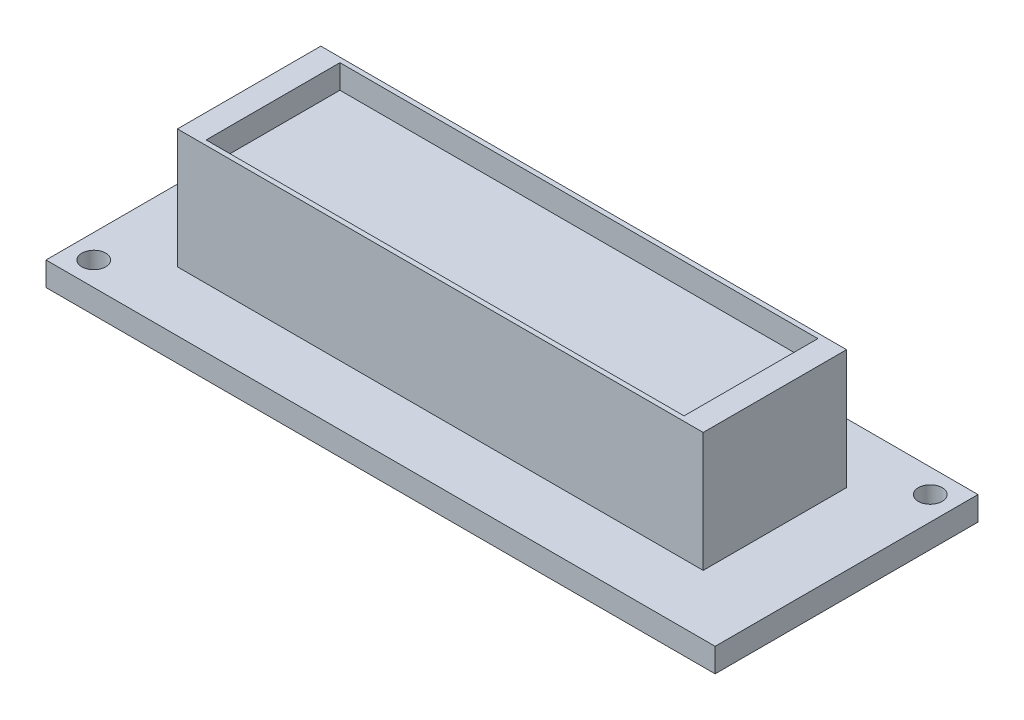
ISO-10303-21;
HEADER;
FILE_DESCRIPTION(('STEP AP214'),'2;1');
FILE_NAME('part.step','',(''),(''),'','','');
FILE_SCHEMA(('AUTOMOTIVE_DESIGN { 1 0 10303 214 1 1 1 1 }'));
ENDSEC;
DATA;
#1=APPLICATION_CONTEXT('core data for automotive mechanical design processes');
#2=APPLICATION_PROTOCOL_DEFINITION('international standard','automotive_design',2000,#1);
#3=PRODUCT_CONTEXT('',#1,'mechanical');
#4=PRODUCT('Part','Part','',(#3));
#5=PRODUCT_RELATED_PRODUCT_CATEGORY('part','',(#4));
#6=PRODUCT_DEFINITION_FORMATION('','',#4);
#7=PRODUCT_DEFINITION_CONTEXT('part definition',#1,'design');
#8=PRODUCT_DEFINITION('design','',#6,#7);
#9=PRODUCT_DEFINITION_SHAPE('','',#8);
#10=(LENGTH_UNIT() NAMED_UNIT(*) SI_UNIT(.MILLI.,.METRE.));
#11=(NAMED_UNIT(*) PLANE_ANGLE_UNIT() SI_UNIT($,.RADIAN.));
#12=(NAMED_UNIT(*) SI_UNIT($,.STERADIAN.) SOLID_ANGLE_UNIT());
#13=UNCERTAINTY_MEASURE_WITH_UNIT(LENGTH_MEASURE(1.E-05),#10,'distance_accuracy_value','');
#14=(GEOMETRIC_REPRESENTATION_CONTEXT(3) GLOBAL_UNCERTAINTY_ASSIGNED_CONTEXT((#13)) GLOBAL_UNIT_ASSIGNED_CONTEXT((#10,
#11,#12)) REPRESENTATION_CONTEXT('',''));
#15=CARTESIAN_POINT('',(0.,0.,0.));
#16=DIRECTION('',(0.,0.,1.));
#17=DIRECTION('',(1.,0.,0.));
#18=AXIS2_PLACEMENT_3D('',#15,#16,#17);
#19=CARTESIAN_POINT('',(0.,1.,-28.));
#20=DIRECTION('',(1.,0.,0.));
#21=DIRECTION('',(0.,0.,-1.));
#22=AXIS2_PLACEMENT_3D('',#19,#20,#21);
#23=PLANE('',#22);
#24=DIRECTION('',(0.,0.,1.));
#25=VECTOR('',#24,1.);
#26=CARTESIAN_POINT('',(0.,1.,0.));
#27=LINE('',#26,#25);
#28=CARTESIAN_POINT('',(0.,1.,-28.));
#29=VERTEX_POINT('',#28);
#30=CARTESIAN_POINT('',(0.,1.,0.));
#31=VERTEX_POINT('',#30);
#32=EDGE_CURVE('E233',#29,#31,#27,.T.);
#33=ORIENTED_EDGE('',*,*,#32,.F.);
#34=DIRECTION('',(0.,-1.,0.));
#35=VECTOR('',#34,1.);
#36=CARTESIAN_POINT('',(0.,1.,-28.));
#37=LINE('',#36,#35);
#38=CARTESIAN_POINT('',(0.,0.,-28.));
#39=VERTEX_POINT('',#38);
#40=EDGE_CURVE('E330',#29,#39,#37,.T.);
#41=ORIENTED_EDGE('',*,*,#40,.T.);
#42=DIRECTION('',(0.,0.,1.));
#43=VECTOR('',#42,1.);
#44=CARTESIAN_POINT('',(0.,0.,-28.));
#45=LINE('',#44,#43);
#46=CARTESIAN_POINT('',(0.,0.,0.));
#47=VERTEX_POINT('',#46);
#48=EDGE_CURVE('E314',#39,#47,#45,.T.);
#49=ORIENTED_EDGE('',*,*,#48,.T.);
#50=DIRECTION('',(0.,-1.,0.));
#51=VECTOR('',#50,1.);
#52=CARTESIAN_POINT('',(0.,1.,0.));
#53=LINE('',#52,#51);
#54=EDGE_CURVE('E11',#31,#47,#53,.T.);
#55=ORIENTED_EDGE('',*,*,#54,.F.);
#56=EDGE_LOOP('',(#33,#41,#49,#55));
#57=FACE_BOUND('',#56,.T.);
#58=ADVANCED_FACE('F41',(#57),#23,.F.);
#59=CARTESIAN_POINT('',(0.,1.,0.));
#60=DIRECTION('',(0.,0.,-1.));
#61=DIRECTION('',(-1.,0.,0.));
#62=AXIS2_PLACEMENT_3D('',#59,#60,#61);
#63=PLANE('',#62);
#64=DIRECTION('',(1.,0.,0.));
#65=VECTOR('',#64,1.);
#66=CARTESIAN_POINT('',(0.,1.,0.));
#67=LINE('',#66,#65);
#68=CARTESIAN_POINT('',(100.,1.,0.));
#69=VERTEX_POINT('',#68);
#70=EDGE_CURVE('E55',#31,#69,#67,.T.);
#71=ORIENTED_EDGE('',*,*,#70,.F.);
#72=ORIENTED_EDGE('',*,*,#54,.T.);
#73=DIRECTION('',(1.,0.,0.));
#74=VECTOR('',#73,1.);
#75=CARTESIAN_POINT('',(0.,0.,0.));
#76=LINE('',#75,#74);
#77=CARTESIAN_POINT('',(100.,0.,0.));
#78=VERTEX_POINT('',#77);
#79=EDGE_CURVE('E318',#47,#78,#76,.T.);
#80=ORIENTED_EDGE('',*,*,#79,.T.);
#81=DIRECTION('',(0.,-1.,0.));
#82=VECTOR('',#81,1.);
#83=CARTESIAN_POINT('',(100.,1.,0.));
#84=LINE('',#83,#82);
#85=EDGE_CURVE('E49',#69,#78,#84,.T.);
#86=ORIENTED_EDGE('',*,*,#85,.F.);
#87=EDGE_LOOP('',(#71,#72,#80,#86));
#88=FACE_BOUND('',#87,.T.);
#89=ADVANCED_FACE('F340',(#88),#63,.F.);
#90=CARTESIAN_POINT('',(100.,1.,0.));
#91=DIRECTION('',(-1.,0.,0.));
#92=DIRECTION('',(0.,0.,1.));
#93=AXIS2_PLACEMENT_3D('',#90,#91,#92);
#94=PLANE('',#93);
#95=DIRECTION('',(0.,0.,-1.));
#96=VECTOR('',#95,1.);
#97=CARTESIAN_POINT('',(100.,1.,0.));
#98=LINE('',#97,#96);
#99=CARTESIAN_POINT('',(100.,1.,-28.));
#100=VERTEX_POINT('',#99);
#101=EDGE_CURVE('E63',#69,#100,#98,.T.);
#102=ORIENTED_EDGE('',*,*,#101,.F.);
#103=ORIENTED_EDGE('',*,*,#85,.T.);
#104=DIRECTION('',(0.,0.,-1.));
#105=VECTOR('',#104,1.);
#106=CARTESIAN_POINT('',(100.,0.,0.));
#107=LINE('',#106,#105);
#108=CARTESIAN_POINT('',(100.,0.,-28.));
#109=VERTEX_POINT('',#108);
#110=EDGE_CURVE('E322',#78,#109,#107,.T.);
#111=ORIENTED_EDGE('',*,*,#110,.T.);
#112=DIRECTION('',(0.,-1.,0.));
#113=VECTOR('',#112,1.);
#114=CARTESIAN_POINT('',(100.,1.,-28.));
#115=LINE('',#114,#113);
#116=EDGE_CURVE('E333',#100,#109,#115,.T.);
#117=ORIENTED_EDGE('',*,*,#116,.F.);
#118=EDGE_LOOP('',(#102,#103,#111,#117));
#119=FACE_BOUND('',#118,.T.);
#120=ADVANCED_FACE('F336',(#119),#94,.F.);
#121=CARTESIAN_POINT('',(100.,1.,-28.));
#122=DIRECTION('',(0.,0.,1.));
#123=DIRECTION('',(1.,0.,0.));
#124=AXIS2_PLACEMENT_3D('',#121,#122,#123);
#125=PLANE('',#124);
#126=DIRECTION('',(-1.,0.,0.));
#127=VECTOR('',#126,1.);
#128=CARTESIAN_POINT('',(0.,1.,-28.));
#129=LINE('',#128,#127);
#130=EDGE_CURVE('E227',#100,#29,#129,.T.);
#131=ORIENTED_EDGE('',*,*,#130,.F.);
#132=ORIENTED_EDGE('',*,*,#116,.T.);
#133=DIRECTION('',(-1.,0.,0.));
#134=VECTOR('',#133,1.);
#135=CARTESIAN_POINT('',(100.,0.,-28.));
#136=LINE('',#135,#134);
#137=EDGE_CURVE('E326',#109,#39,#136,.T.);
#138=ORIENTED_EDGE('',*,*,#137,.T.);
#139=ORIENTED_EDGE('',*,*,#40,.F.);
#140=EDGE_LOOP('',(#131,#132,#138,#139));
#141=FACE_BOUND('',#140,.T.);
#142=ADVANCED_FACE('F345',(#141),#125,.F.);
#143=CARTESIAN_POINT('',(0.,0.,0.));
#144=DIRECTION('',(0.,1.,0.));
#145=DIRECTION('',(0.,0.,1.));
#146=AXIS2_PLACEMENT_3D('',#143,#144,#145);
#147=PLANE('',#146);
#148=ORIENTED_EDGE('',*,*,#48,.F.);
#149=ORIENTED_EDGE('',*,*,#137,.F.);
#150=ORIENTED_EDGE('',*,*,#110,.F.);
#151=ORIENTED_EDGE('',*,*,#79,.F.);
#152=EDGE_LOOP('',(#148,#149,#150,#151));
#153=FACE_BOUND('',#152,.T.);
#154=ADVANCED_FACE('F343',(#153),#147,.F.);
#155=CARTESIAN_POINT('',(0.,31.,-28.));
#156=DIRECTION('',(0.,0.,1.));
#157=DIRECTION('',(1.,0.,0.));
#158=AXIS2_PLACEMENT_3D('',#155,#156,#157);
#159=PLANE('',#158);
#160=DIRECTION('',(-1.,0.,0.));
#161=VECTOR('',#160,1.);
#162=CARTESIAN_POINT('',(0.,26.,-28.));
#163=LINE('',#162,#161);
#164=CARTESIAN_POINT('',(100.,26.,-28.));
#165=VERTEX_POINT('',#164);
#166=CARTESIAN_POINT('',(0.,26.,-28.));
#167=VERTEX_POINT('',#166);
#168=EDGE_CURVE('E310',#165,#167,#163,.T.);
#169=ORIENTED_EDGE('',*,*,#168,.F.);
#170=DIRECTION('',(0.,-1.,0.));
#171=VECTOR('',#170,1.);
#172=CARTESIAN_POINT('',(100.,31.,-28.));
#173=LINE('',#172,#171);
#174=CARTESIAN_POINT('',(100.,31.,-28.));
#175=VERTEX_POINT('',#174);
#176=EDGE_CURVE('E281',#175,#165,#173,.T.);
#177=ORIENTED_EDGE('',*,*,#176,.F.);
#178=DIRECTION('',(-1.,0.,0.));
#179=VECTOR('',#178,1.);
#180=CARTESIAN_POINT('',(0.,31.,-28.));
#181=LINE('',#180,#179);
#182=CARTESIAN_POINT('',(0.,31.,-28.));
#183=VERTEX_POINT('',#182);
#184=EDGE_CURVE('E242',#175,#183,#181,.T.);
#185=ORIENTED_EDGE('',*,*,#184,.T.);
#186=DIRECTION('',(0.,-1.,0.));
#187=VECTOR('',#186,1.);
#188=CARTESIAN_POINT('',(0.,31.,-28.));
#189=LINE('',#188,#187);
#190=EDGE_CURVE('E269',#183,#167,#189,.T.);
#191=ORIENTED_EDGE('',*,*,#190,.T.);
#192=EDGE_LOOP('',(#169,#177,#185,#191));
#193=FACE_BOUND('',#192,.T.);
#194=ADVANCED_FACE('F362',(#193),#159,.T.);
#195=CARTESIAN_POINT('',(100.,31.,0.));
#196=DIRECTION('',(-1.,0.,0.));
#197=DIRECTION('',(0.,0.,1.));
#198=AXIS2_PLACEMENT_3D('',#195,#196,#197);
#199=PLANE('',#198);
#200=DIRECTION('',(0.,0.,-1.));
#201=VECTOR('',#200,1.);
#202=CARTESIAN_POINT('',(100.,26.,-28.));
#203=LINE('',#202,#201);
#204=CARTESIAN_POINT('',(100.,26.,0.));
#205=VERTEX_POINT('',#204);
#206=EDGE_CURVE('E306',#205,#165,#203,.T.);
#207=ORIENTED_EDGE('',*,*,#206,.F.);
#208=DIRECTION('',(0.,-1.,0.));
#209=VECTOR('',#208,1.);
#210=CARTESIAN_POINT('',(100.,31.,0.));
#211=LINE('',#210,#209);
#212=CARTESIAN_POINT('',(100.,31.,0.));
#213=VERTEX_POINT('',#212);
#214=EDGE_CURVE('E277',#213,#205,#211,.T.);
#215=ORIENTED_EDGE('',*,*,#214,.F.);
#216=DIRECTION('',(0.,0.,-1.));
#217=VECTOR('',#216,1.);
#218=CARTESIAN_POINT('',(100.,31.,0.));
#219=LINE('',#218,#217);
#220=EDGE_CURVE('E246',#213,#175,#219,.T.);
#221=ORIENTED_EDGE('',*,*,#220,.T.);
#222=ORIENTED_EDGE('',*,*,#176,.T.);
#223=EDGE_LOOP('',(#207,#215,#221,#222));
#224=FACE_BOUND('',#223,.T.);
#225=ADVANCED_FACE('F388',(#224),#199,.T.);
#226=CARTESIAN_POINT('',(0.,31.,0.));
#227=DIRECTION('',(0.,0.,-1.));
#228=DIRECTION('',(-1.,0.,0.));
#229=AXIS2_PLACEMENT_3D('',#226,#227,#228);
#230=PLANE('',#229);
#231=DIRECTION('',(1.,0.,0.));
#232=VECTOR('',#231,1.);
#233=CARTESIAN_POINT('',(100.,26.,0.));
#234=LINE('',#233,#232);
#235=CARTESIAN_POINT('',(0.,26.,0.));
#236=VERTEX_POINT('',#235);
#237=EDGE_CURVE('E302',#236,#205,#234,.T.);
#238=ORIENTED_EDGE('',*,*,#237,.F.);
#239=DIRECTION('',(0.,-1.,0.));
#240=VECTOR('',#239,1.);
#241=CARTESIAN_POINT('',(0.,31.,0.));
#242=LINE('',#241,#240);
#243=CARTESIAN_POINT('',(0.,31.,0.));
#244=VERTEX_POINT('',#243);
#245=EDGE_CURVE('E273',#244,#236,#242,.T.);
#246=ORIENTED_EDGE('',*,*,#245,.F.);
#247=DIRECTION('',(1.,0.,0.));
#248=VECTOR('',#247,1.);
#249=CARTESIAN_POINT('',(0.,31.,0.));
#250=LINE('',#249,#248);
#251=EDGE_CURVE('E250',#244,#213,#250,.T.);
#252=ORIENTED_EDGE('',*,*,#251,.T.);
#253=ORIENTED_EDGE('',*,*,#214,.T.);
#254=EDGE_LOOP('',(#238,#246,#252,#253));
#255=FACE_BOUND('',#254,.T.);
#256=ADVANCED_FACE('F392',(#255),#230,.T.);
#257=CARTESIAN_POINT('',(0.,31.,0.));
#258=DIRECTION('',(1.,0.,0.));
#259=DIRECTION('',(0.,0.,-1.));
#260=AXIS2_PLACEMENT_3D('',#257,#258,#259);
#261=PLANE('',#260);
#262=DIRECTION('',(0.,0.,1.));
#263=VECTOR('',#262,1.);
#264=CARTESIAN_POINT('',(0.,26.,0.));
#265=LINE('',#264,#263);
#266=EDGE_CURVE('E285',#167,#236,#265,.T.);
#267=ORIENTED_EDGE('',*,*,#266,.F.);
#268=ORIENTED_EDGE('',*,*,#190,.F.);
#269=DIRECTION('',(0.,0.,1.));
#270=VECTOR('',#269,1.);
#271=CARTESIAN_POINT('',(0.,31.,0.));
#272=LINE('',#271,#270);
#273=EDGE_CURVE('E254',#183,#244,#272,.T.);
#274=ORIENTED_EDGE('',*,*,#273,.T.);
#275=ORIENTED_EDGE('',*,*,#245,.T.);
#276=EDGE_LOOP('',(#267,#268,#274,#275));
#277=FACE_BOUND('',#276,.T.);
#278=ADVANCED_FACE('F372',(#277),#261,.T.);
#279=CARTESIAN_POINT('',(105.,31.,0.));
#280=DIRECTION('',(1.,0.,0.));
#281=DIRECTION('',(0.,0.,-1.));
#282=AXIS2_PLACEMENT_3D('',#279,#280,#281);
#283=PLANE('',#282);
#284=DIRECTION('',(0.,-1.,0.));
#285=VECTOR('',#284,1.);
#286=CARTESIAN_POINT('',(105.,31.,1.));
#287=LINE('',#286,#285);
#288=CARTESIAN_POINT('',(105.,31.,1.));
#289=VERTEX_POINT('',#288);
#290=CARTESIAN_POINT('',(105.,6.,1.));
#291=VERTEX_POINT('',#290);
#292=EDGE_CURVE('E258',#289,#291,#287,.T.);
#293=ORIENTED_EDGE('',*,*,#292,.T.);
#294=DIRECTION('',(0.,0.,1.));
#295=VECTOR('',#294,1.);
#296=CARTESIAN_POINT('',(105.,6.,0.));
#297=LINE('',#296,#295);
#298=CARTESIAN_POINT('',(105.,6.,-29.));
#299=VERTEX_POINT('',#298);
#300=EDGE_CURVE('E219',#299,#291,#297,.T.);
#301=ORIENTED_EDGE('',*,*,#300,.F.);
#302=DIRECTION('',(0.,-1.,0.));
#303=VECTOR('',#302,1.);
#304=CARTESIAN_POINT('',(105.,31.,-29.));
#305=LINE('',#304,#303);
#306=CARTESIAN_POINT('',(105.,31.,-29.));
#307=VERTEX_POINT('',#306);
#308=EDGE_CURVE('E274',#307,#299,#305,.T.);
#309=ORIENTED_EDGE('',*,*,#308,.F.);
#310=DIRECTION('',(0.,0.,1.));
#311=VECTOR('',#310,1.);
#312=CARTESIAN_POINT('',(105.,31.,0.));
#313=LINE('',#312,#311);
#314=EDGE_CURVE('E228',#307,#289,#313,.T.);
#315=ORIENTED_EDGE('',*,*,#314,.T.);
#316=EDGE_LOOP('',(#293,#301,#309,#315));
#317=FACE_BOUND('',#316,.T.);
#318=ADVANCED_FACE('F368',(#317),#283,.T.);
#319=CARTESIAN_POINT('',(0.,31.,-29.));
#320=DIRECTION('',(0.,0.,1.));
#321=DIRECTION('',(1.,0.,0.));
#322=AXIS2_PLACEMENT_3D('',#319,#320,#321);
#323=PLANE('',#322);
#324=DIRECTION('',(1.,0.,0.));
#325=VECTOR('',#324,1.);
#326=CARTESIAN_POINT('',(0.,6.,-29.));
#327=LINE('',#326,#325);
#328=CARTESIAN_POINT('',(-4.99999999999999,6.,-29.));
#329=VERTEX_POINT('',#328);
#330=EDGE_CURVE('E223',#329,#299,#327,.T.);
#331=ORIENTED_EDGE('',*,*,#330,.F.);
#332=DIRECTION('',(0.,-1.,0.));
#333=VECTOR('',#332,1.);
#334=CARTESIAN_POINT('',(-4.99999999999999,31.,-29.));
#335=LINE('',#334,#333);
#336=CARTESIAN_POINT('',(-4.99999999999999,31.,-29.));
#337=VERTEX_POINT('',#336);
#338=EDGE_CURVE('E292',#337,#329,#335,.T.);
#339=ORIENTED_EDGE('',*,*,#338,.F.);
#340=DIRECTION('',(-1.,0.,0.));
#341=VECTOR('',#340,1.);
#342=CARTESIAN_POINT('',(0.,31.,-29.));
#343=LINE('',#342,#341);
#344=EDGE_CURVE('E232',#307,#337,#343,.T.);
#345=ORIENTED_EDGE('',*,*,#344,.F.);
#346=ORIENTED_EDGE('',*,*,#308,.T.);
#347=EDGE_LOOP('',(#331,#339,#345,#346));
#348=FACE_BOUND('',#347,.T.);
#349=ADVANCED_FACE('F371',(#348),#323,.F.);
#350=CARTESIAN_POINT('',(-4.99999999999999,31.,0.));
#351=DIRECTION('',(1.,0.,0.));
#352=DIRECTION('',(0.,0.,-1.));
#353=AXIS2_PLACEMENT_3D('',#350,#351,#352);
#354=PLANE('',#353);
#355=DIRECTION('',(0.,0.,-1.));
#356=VECTOR('',#355,1.);
#357=CARTESIAN_POINT('',(-4.99999999999999,6.,0.));
#358=LINE('',#357,#356);
#359=CARTESIAN_POINT('',(-4.99999999999999,6.,1.));
#360=VERTEX_POINT('',#359);
#361=EDGE_CURVE('E206',#360,#329,#358,.T.);
#362=ORIENTED_EDGE('',*,*,#361,.F.);
#363=DIRECTION('',(0.,-1.,0.));
#364=VECTOR('',#363,1.);
#365=CARTESIAN_POINT('',(-4.99999999999999,31.,1.));
#366=LINE('',#365,#364);
#367=CARTESIAN_POINT('',(-4.99999999999999,31.,1.));
#368=VERTEX_POINT('',#367);
#369=EDGE_CURVE('E289',#368,#360,#366,.T.);
#370=ORIENTED_EDGE('',*,*,#369,.F.);
#371=DIRECTION('',(0.,0.,1.));
#372=VECTOR('',#371,1.);
#373=CARTESIAN_POINT('',(-4.99999999999999,31.,0.));
#374=LINE('',#373,#372);
#375=EDGE_CURVE('E236',#337,#368,#374,.T.);
#376=ORIENTED_EDGE('',*,*,#375,.F.);
#377=ORIENTED_EDGE('',*,*,#338,.T.);
#378=EDGE_LOOP('',(#362,#370,#376,#377));
#379=FACE_BOUND('',#378,.T.);
#380=ADVANCED_FACE('F376',(#379),#354,.F.);
#381=CARTESIAN_POINT('',(0.,31.,1.));
#382=DIRECTION('',(0.,0.,-1.));
#383=DIRECTION('',(-1.,0.,0.));
#384=AXIS2_PLACEMENT_3D('',#381,#382,#383);
#385=PLANE('',#384);
#386=DIRECTION('',(-1.,0.,0.));
#387=VECTOR('',#386,1.);
#388=CARTESIAN_POINT('',(0.,6.,1.));
#389=LINE('',#388,#387);
#390=EDGE_CURVE('E215',#291,#360,#389,.T.);
#391=ORIENTED_EDGE('',*,*,#390,.F.);
#392=ORIENTED_EDGE('',*,*,#292,.F.);
#393=DIRECTION('',(1.,0.,0.));
#394=VECTOR('',#393,1.);
#395=CARTESIAN_POINT('',(0.,31.,1.));
#396=LINE('',#395,#394);
#397=EDGE_CURVE('E239',#368,#289,#396,.T.);
#398=ORIENTED_EDGE('',*,*,#397,.F.);
#399=ORIENTED_EDGE('',*,*,#369,.T.);
#400=EDGE_LOOP('',(#391,#392,#398,#399));
#401=FACE_BOUND('',#400,.T.);
#402=ADVANCED_FACE('F380',(#401),#385,.F.);
#403=CARTESIAN_POINT('',(0.,31.,0.));
#404=DIRECTION('',(0.,1.,0.));
#405=DIRECTION('',(0.,0.,1.));
#406=AXIS2_PLACEMENT_3D('',#403,#404,#405);
#407=PLANE('',#406);
#408=ORIENTED_EDGE('',*,*,#314,.F.);
#409=ORIENTED_EDGE('',*,*,#344,.T.);
#410=ORIENTED_EDGE('',*,*,#375,.T.);
#411=ORIENTED_EDGE('',*,*,#397,.T.);
#412=EDGE_LOOP('',(#408,#409,#410,#411));
#413=FACE_BOUND('',#412,.T.);
#414=ORIENTED_EDGE('',*,*,#184,.F.);
#415=ORIENTED_EDGE('',*,*,#220,.F.);
#416=ORIENTED_EDGE('',*,*,#251,.F.);
#417=ORIENTED_EDGE('',*,*,#273,.F.);
#418=EDGE_LOOP('',(#414,#415,#416,#417));
#419=FACE_BOUND('',#418,.T.);
#420=ADVANCED_FACE('F384',(#413,#419),#407,.T.);
#421=CARTESIAN_POINT('',(0.,1.,0.));
#422=DIRECTION('',(0.,1.,0.));
#423=DIRECTION('',(0.,0.,1.));
#424=AXIS2_PLACEMENT_3D('',#421,#422,#423);
#425=PLANE('',#424);
#426=CARTESIAN_POINT('',(-15.,1.,8.50000000000001));
#427=DIRECTION('',(0.,1.,0.));
#428=DIRECTION('',(0.,0.,1.));
#429=AXIS2_PLACEMENT_3D('',#426,#427,#428);
#430=CIRCLE('',#429,2.5);
#431=CARTESIAN_POINT('',(-15.,1.,11.));
#432=VERTEX_POINT('',#431);
#433=EDGE_CURVE('E189',#432,#432,#430,.T.);
#434=ORIENTED_EDGE('',*,*,#433,.T.);
#435=EDGE_LOOP('',(#434));
#436=FACE_BOUND('',#435,.T.);
#437=CARTESIAN_POINT('',(115.,1.,-36.5));
#438=DIRECTION('',(0.,1.,0.));
#439=DIRECTION('',(0.,0.,1.));
#440=AXIS2_PLACEMENT_3D('',#437,#438,#439);
#441=CIRCLE('',#440,2.50000000000001);
#442=CARTESIAN_POINT('',(115.,1.,-34.));
#443=VERTEX_POINT('',#442);
#444=EDGE_CURVE('E437',#443,#443,#441,.T.);
#445=ORIENTED_EDGE('',*,*,#444,.T.);
#446=EDGE_LOOP('',(#445));
#447=FACE_BOUND('',#446,.T.);
#448=ORIENTED_EDGE('',*,*,#130,.T.);
#449=ORIENTED_EDGE('',*,*,#32,.T.);
#450=ORIENTED_EDGE('',*,*,#70,.T.);
#451=ORIENTED_EDGE('',*,*,#101,.T.);
#452=EDGE_LOOP('',(#448,#449,#450,#451));
#453=FACE_BOUND('',#452,.T.);
#454=DIRECTION('',(1.,0.,0.));
#455=VECTOR('',#454,1.);
#456=CARTESIAN_POINT('',(0.,1.,13.5));
#457=LINE('',#456,#455);
#458=CARTESIAN_POINT('',(-20.,1.,13.5));
#459=VERTEX_POINT('',#458);
#460=CARTESIAN_POINT('',(120.,1.,13.5));
#461=VERTEX_POINT('',#460);
#462=EDGE_CURVE('E172',#459,#461,#457,.T.);
#463=ORIENTED_EDGE('',*,*,#462,.F.);
#464=DIRECTION('',(0.,0.,1.));
#465=VECTOR('',#464,1.);
#466=CARTESIAN_POINT('',(-20.,1.,0.));
#467=LINE('',#466,#465);
#468=CARTESIAN_POINT('',(-20.,1.,-41.5));
#469=VERTEX_POINT('',#468);
#470=EDGE_CURVE('E166',#469,#459,#467,.T.);
#471=ORIENTED_EDGE('',*,*,#470,.F.);
#472=DIRECTION('',(1.,0.,0.));
#473=VECTOR('',#472,1.);
#474=CARTESIAN_POINT('',(0.,1.,-41.5));
#475=LINE('',#474,#473);
#476=CARTESIAN_POINT('',(120.,1.,-41.5));
#477=VERTEX_POINT('',#476);
#478=EDGE_CURVE('E175',#469,#477,#475,.T.);
#479=ORIENTED_EDGE('',*,*,#478,.T.);
#480=DIRECTION('',(0.,0.,-1.));
#481=VECTOR('',#480,1.);
#482=CARTESIAN_POINT('',(120.,1.,0.));
#483=LINE('',#482,#481);
#484=EDGE_CURVE('E157',#461,#477,#483,.T.);
#485=ORIENTED_EDGE('',*,*,#484,.F.);
#486=EDGE_LOOP('',(#463,#471,#479,#485));
#487=FACE_BOUND('',#486,.T.);
#488=ADVANCED_FACE('F170',(#436,#447,#453,#487),#425,.F.);
#489=CARTESIAN_POINT('',(0.,6.,0.));
#490=DIRECTION('',(0.,-1.,0.));
#491=DIRECTION('',(0.,0.,-1.));
#492=AXIS2_PLACEMENT_3D('',#489,#490,#491);
#493=PLANE('',#492);
#494=CARTESIAN_POINT('',(-15.,6.,8.50000000000001));
#495=DIRECTION('',(0.,1.,0.));
#496=DIRECTION('',(0.,0.,1.));
#497=AXIS2_PLACEMENT_3D('',#494,#495,#496);
#498=CIRCLE('',#497,2.5);
#499=CARTESIAN_POINT('',(-15.,6.,11.));
#500=VERTEX_POINT('',#499);
#501=EDGE_CURVE('E433',#500,#500,#498,.T.);
#502=ORIENTED_EDGE('',*,*,#501,.F.);
#503=EDGE_LOOP('',(#502));
#504=FACE_BOUND('',#503,.T.);
#505=CARTESIAN_POINT('',(115.,6.,-36.5));
#506=DIRECTION('',(0.,1.,0.));
#507=DIRECTION('',(0.,0.,1.));
#508=AXIS2_PLACEMENT_3D('',#505,#506,#507);
#509=CIRCLE('',#508,2.50000000000001);
#510=CARTESIAN_POINT('',(115.,6.,-34.));
#511=VERTEX_POINT('',#510);
#512=EDGE_CURVE('E443',#511,#511,#509,.T.);
#513=ORIENTED_EDGE('',*,*,#512,.F.);
#514=EDGE_LOOP('',(#513));
#515=FACE_BOUND('',#514,.T.);
#516=ORIENTED_EDGE('',*,*,#361,.T.);
#517=ORIENTED_EDGE('',*,*,#330,.T.);
#518=ORIENTED_EDGE('',*,*,#300,.T.);
#519=ORIENTED_EDGE('',*,*,#390,.T.);
#520=EDGE_LOOP('',(#516,#517,#518,#519));
#521=FACE_BOUND('',#520,.T.);
#522=DIRECTION('',(1.,0.,0.));
#523=VECTOR('',#522,1.);
#524=CARTESIAN_POINT('',(0.,6.,13.5));
#525=LINE('',#524,#523);
#526=CARTESIAN_POINT('',(-20.,6.,13.5));
#527=VERTEX_POINT('',#526);
#528=CARTESIAN_POINT('',(120.,6.,13.5));
#529=VERTEX_POINT('',#528);
#530=EDGE_CURVE('E196',#527,#529,#525,.T.);
#531=ORIENTED_EDGE('',*,*,#530,.T.);
#532=DIRECTION('',(0.,0.,-1.));
#533=VECTOR('',#532,1.);
#534=CARTESIAN_POINT('',(120.,6.,0.));
#535=LINE('',#534,#533);
#536=CARTESIAN_POINT('',(120.,6.,-41.5));
#537=VERTEX_POINT('',#536);
#538=EDGE_CURVE('E159',#529,#537,#535,.T.);
#539=ORIENTED_EDGE('',*,*,#538,.T.);
#540=DIRECTION('',(1.,0.,0.));
#541=VECTOR('',#540,1.);
#542=CARTESIAN_POINT('',(0.,6.,-41.5));
#543=LINE('',#542,#541);
#544=CARTESIAN_POINT('',(-20.,6.,-41.5));
#545=VERTEX_POINT('',#544);
#546=EDGE_CURVE('E186',#545,#537,#543,.T.);
#547=ORIENTED_EDGE('',*,*,#546,.F.);
#548=DIRECTION('',(0.,0.,1.));
#549=VECTOR('',#548,1.);
#550=CARTESIAN_POINT('',(-20.,6.,0.));
#551=LINE('',#550,#549);
#552=EDGE_CURVE('E182',#545,#527,#551,.T.);
#553=ORIENTED_EDGE('',*,*,#552,.T.);
#554=EDGE_LOOP('',(#531,#539,#547,#553));
#555=FACE_BOUND('',#554,.T.);
#556=ADVANCED_FACE('F402',(#504,#515,#521,#555),#493,.F.);
#557=CARTESIAN_POINT('',(0.,1.,13.5));
#558=DIRECTION('',(0.,0.,1.));
#559=DIRECTION('',(1.,0.,0.));
#560=AXIS2_PLACEMENT_3D('',#557,#558,#559);
#561=PLANE('',#560);
#562=ORIENTED_EDGE('',*,*,#530,.F.);
#563=DIRECTION('',(0.,1.,0.));
#564=VECTOR('',#563,1.);
#565=CARTESIAN_POINT('',(-20.,1.,13.5));
#566=LINE('',#565,#564);
#567=EDGE_CURVE('E180',#459,#527,#566,.T.);
#568=ORIENTED_EDGE('',*,*,#567,.F.);
#569=ORIENTED_EDGE('',*,*,#462,.T.);
#570=DIRECTION('',(0.,1.,0.));
#571=VECTOR('',#570,1.);
#572=CARTESIAN_POINT('',(120.,1.,13.5));
#573=LINE('',#572,#571);
#574=EDGE_CURVE('E154',#461,#529,#573,.T.);
#575=ORIENTED_EDGE('',*,*,#574,.T.);
#576=EDGE_LOOP('',(#562,#568,#569,#575));
#577=FACE_BOUND('',#576,.T.);
#578=ADVANCED_FACE('F179',(#577),#561,.T.);
#579=CARTESIAN_POINT('',(-20.,1.,0.));
#580=DIRECTION('',(-1.,0.,0.));
#581=DIRECTION('',(0.,0.,1.));
#582=AXIS2_PLACEMENT_3D('',#579,#580,#581);
#583=PLANE('',#582);
#584=ORIENTED_EDGE('',*,*,#552,.F.);
#585=DIRECTION('',(0.,1.,0.));
#586=VECTOR('',#585,1.);
#587=CARTESIAN_POINT('',(-20.,1.,-41.5));
#588=LINE('',#587,#586);
#589=EDGE_CURVE('E207',#469,#545,#588,.T.);
#590=ORIENTED_EDGE('',*,*,#589,.F.);
#591=ORIENTED_EDGE('',*,*,#470,.T.);
#592=ORIENTED_EDGE('',*,*,#567,.T.);
#593=EDGE_LOOP('',(#584,#590,#591,#592));
#594=FACE_BOUND('',#593,.T.);
#595=ADVANCED_FACE('F412',(#594),#583,.T.);
#596=CARTESIAN_POINT('',(0.,1.,-41.5));
#597=DIRECTION('',(0.,0.,1.));
#598=DIRECTION('',(1.,0.,0.));
#599=AXIS2_PLACEMENT_3D('',#596,#597,#598);
#600=PLANE('',#599);
#601=ORIENTED_EDGE('',*,*,#546,.T.);
#602=DIRECTION('',(0.,1.,0.));
#603=VECTOR('',#602,1.);
#604=CARTESIAN_POINT('',(120.,1.,-41.5));
#605=LINE('',#604,#603);
#606=EDGE_CURVE('E165',#477,#537,#605,.T.);
#607=ORIENTED_EDGE('',*,*,#606,.F.);
#608=ORIENTED_EDGE('',*,*,#478,.F.);
#609=ORIENTED_EDGE('',*,*,#589,.T.);
#610=EDGE_LOOP('',(#601,#607,#608,#609));
#611=FACE_BOUND('',#610,.T.);
#612=ADVANCED_FACE('F415',(#611),#600,.F.);
#613=CARTESIAN_POINT('',(120.,1.,0.));
#614=DIRECTION('',(1.,0.,0.));
#615=DIRECTION('',(0.,0.,-1.));
#616=AXIS2_PLACEMENT_3D('',#613,#614,#615);
#617=PLANE('',#616);
#618=ORIENTED_EDGE('',*,*,#538,.F.);
#619=ORIENTED_EDGE('',*,*,#574,.F.);
#620=ORIENTED_EDGE('',*,*,#484,.T.);
#621=ORIENTED_EDGE('',*,*,#606,.T.);
#622=EDGE_LOOP('',(#618,#619,#620,#621));
#623=FACE_BOUND('',#622,.T.);
#624=ADVANCED_FACE('F156',(#623),#617,.T.);
#625=CARTESIAN_POINT('',(0.,26.,0.));
#626=DIRECTION('',(0.,-1.,0.));
#627=DIRECTION('',(0.,0.,-1.));
#628=AXIS2_PLACEMENT_3D('',#625,#626,#627);
#629=PLANE('',#628);
#630=ORIENTED_EDGE('',*,*,#266,.T.);
#631=ORIENTED_EDGE('',*,*,#237,.T.);
#632=ORIENTED_EDGE('',*,*,#206,.T.);
#633=ORIENTED_EDGE('',*,*,#168,.T.);
#634=EDGE_LOOP('',(#630,#631,#632,#633));
#635=FACE_BOUND('',#634,.T.);
#636=ADVANCED_FACE('F363',(#635),#629,.F.);
#637=CARTESIAN_POINT('',(115.,-19.,-36.5));
#638=DIRECTION('',(0.,1.,0.));
#639=DIRECTION('',(0.,0.,1.));
#640=AXIS2_PLACEMENT_3D('',#637,#638,#639);
#641=CYLINDRICAL_SURFACE('',#640,2.50000000000001);
#642=ORIENTED_EDGE('',*,*,#512,.T.);
#643=EDGE_LOOP('',(#642));
#644=FACE_BOUND('',#643,.T.);
#645=ORIENTED_EDGE('',*,*,#444,.F.);
#646=EDGE_LOOP('',(#645));
#647=FACE_BOUND('',#646,.T.);
#648=ADVANCED_FACE('F366',(#644,#647),#641,.F.);
#649=CARTESIAN_POINT('',(-15.,-19.,8.50000000000001));
#650=DIRECTION('',(0.,1.,0.));
#651=DIRECTION('',(0.,0.,1.));
#652=AXIS2_PLACEMENT_3D('',#649,#650,#651);
#653=CYLINDRICAL_SURFACE('',#652,2.5);
#654=ORIENTED_EDGE('',*,*,#501,.T.);
#655=EDGE_LOOP('',(#654));
#656=FACE_BOUND('',#655,.T.);
#657=ORIENTED_EDGE('',*,*,#433,.F.);
#658=EDGE_LOOP('',(#657));
#659=FACE_BOUND('',#658,.T.);
#660=ADVANCED_FACE('F424',(#656,#659),#653,.F.);
#661=CLOSED_SHELL('',(#58,#89,#120,#142,#154,#194,#225,#256,#278,#318,#349,#380,#402,#420,#488,
#556,#578,#595,#612,#624,#636,#648,#660));
#662=MANIFOLD_SOLID_BREP('B2',#661);
#663=ADVANCED_BREP_SHAPE_REPRESENTATION('',(#18,#662),#14);
#664=SHAPE_DEFINITION_REPRESENTATION(#9,#663);
ENDSEC;
END-ISO-10303-21;
